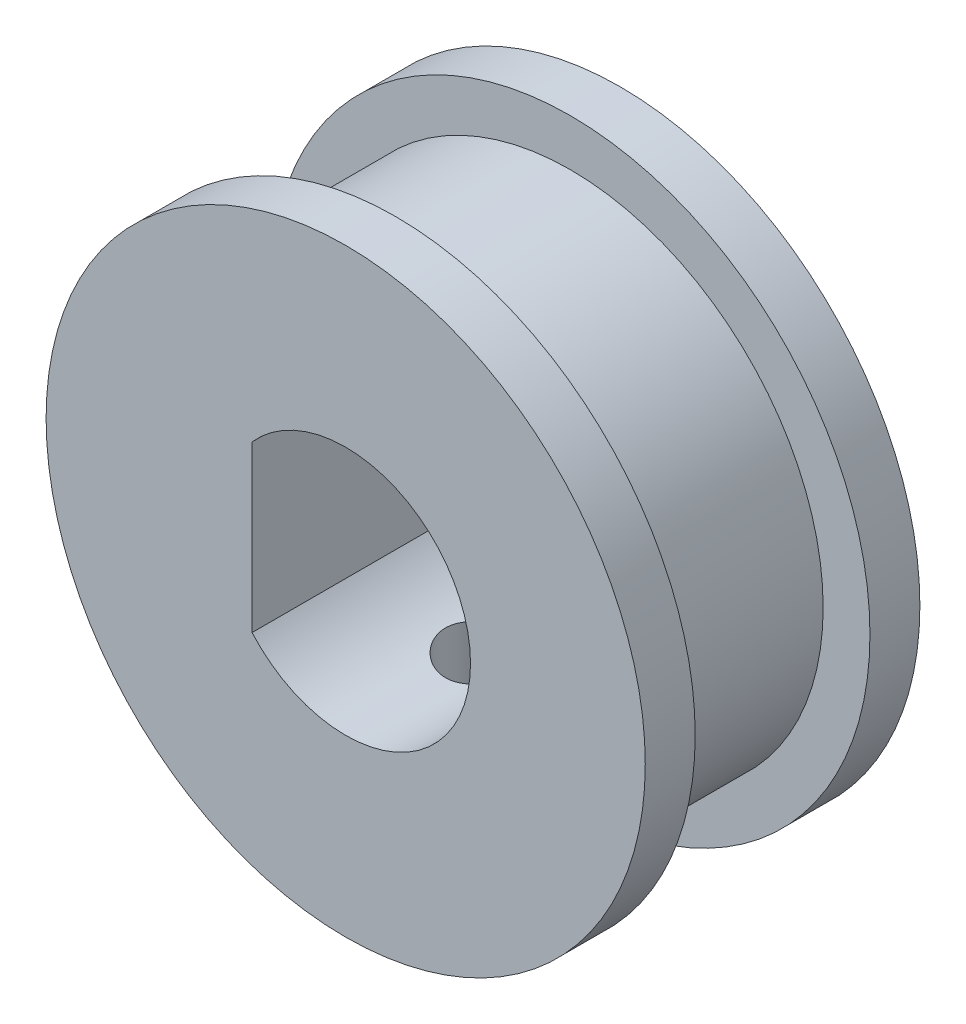
ISO-10303-21;
HEADER;
FILE_DESCRIPTION(('STEP AP214'),'2;1');
FILE_NAME('part.step','',(''),(''),'','','');
FILE_SCHEMA(('AUTOMOTIVE_DESIGN { 1 0 10303 214 1 1 1 1 }'));
ENDSEC;
DATA;
#1=APPLICATION_CONTEXT('core data for automotive mechanical design processes');
#2=APPLICATION_PROTOCOL_DEFINITION('international standard','automotive_design',2000,#1);
#3=PRODUCT_CONTEXT('',#1,'mechanical');
#4=PRODUCT('Part','Part','',(#3));
#5=PRODUCT_RELATED_PRODUCT_CATEGORY('part','',(#4));
#6=PRODUCT_DEFINITION_FORMATION('','',#4);
#7=PRODUCT_DEFINITION_CONTEXT('part definition',#1,'design');
#8=PRODUCT_DEFINITION('design','',#6,#7);
#9=PRODUCT_DEFINITION_SHAPE('','',#8);
#10=(LENGTH_UNIT() NAMED_UNIT(*) SI_UNIT(.MILLI.,.METRE.));
#11=(NAMED_UNIT(*) PLANE_ANGLE_UNIT() SI_UNIT($,.RADIAN.));
#12=(NAMED_UNIT(*) SI_UNIT($,.STERADIAN.) SOLID_ANGLE_UNIT());
#13=UNCERTAINTY_MEASURE_WITH_UNIT(LENGTH_MEASURE(1.E-05),#10,'distance_accuracy_value','');
#14=(GEOMETRIC_REPRESENTATION_CONTEXT(3) GLOBAL_UNCERTAINTY_ASSIGNED_CONTEXT((#13)) GLOBAL_UNIT_ASSIGNED_CONTEXT((#10,
#11,#12)) REPRESENTATION_CONTEXT('',''));
#15=CARTESIAN_POINT('',(0.,0.,0.));
#16=DIRECTION('',(0.,0.,1.));
#17=DIRECTION('',(1.,0.,0.));
#18=AXIS2_PLACEMENT_3D('',#15,#16,#17);
#19=CARTESIAN_POINT('',(0.,0.,3.5));
#20=DIRECTION('',(0.,0.,-1.));
#21=DIRECTION('',(-1.,0.,0.));
#22=AXIS2_PLACEMENT_3D('',#19,#20,#21);
#23=CYLINDRICAL_SURFACE('',#22,10.125);
#24=CARTESIAN_POINT('',(0.,-10.125,1.5));
#25=CARTESIAN_POINT('',(0.0837638113652493,-10.1249986690809,1.4999965364608));
#26=CARTESIAN_POINT('',(0.167576527266674,-10.1239496365079,1.49295993930032));
#27=CARTESIAN_POINT('',(0.332860107909288,-10.1198657946306,1.46500611770191));
#28=CARTESIAN_POINT('',(0.414328597579588,-10.1168290406185,1.44407529942512));
#29=CARTESIAN_POINT('',(0.572507755255597,-10.1091110862003,1.38897147390049));
#30=CARTESIAN_POINT('',(0.649221938171266,-10.1044311181231,1.35480838822025));
#31=CARTESIAN_POINT('',(0.795816796864536,-10.0939441396108,1.27423384307133));
#32=CARTESIAN_POINT('',(0.865698437520783,-10.0881372886587,1.2278241164839));
#33=CARTESIAN_POINT('',(0.997189526627415,-10.0759929611263,1.12369640264024));
#34=CARTESIAN_POINT('',(1.05873930827636,-10.0696521357657,1.06590345157246));
#35=CARTESIAN_POINT('',(1.17130478357067,-10.0571807833803,0.940811114197306));
#36=CARTESIAN_POINT('',(1.22231987716081,-10.0510502683515,0.873511186740605));
#37=CARTESIAN_POINT('',(1.31259935386314,-10.0396611330402,0.730915392536569));
#38=CARTESIAN_POINT('',(1.35180614707092,-10.034406839944,0.655582689202163));
#39=CARTESIAN_POINT('',(1.41698807406035,-10.0254106709424,0.49931062237877));
#40=CARTESIAN_POINT('',(1.44296391115152,-10.0216687146488,0.418371557163469));
#41=CARTESIAN_POINT('',(1.48076156498896,-10.0161537544874,0.253811248545279));
#42=CARTESIAN_POINT('',(1.49268543046269,-10.014366561579,0.170213928763024));
#43=CARTESIAN_POINT('',(1.50235677490334,-10.0129203791319,0.0021873130000883));
#44=CARTESIAN_POINT('',(1.50010504814121,-10.0132612703549,-0.0822419361022005));
#45=CARTESIAN_POINT('',(1.48157255204166,-10.01601976372,-0.248815669839024));
#46=CARTESIAN_POINT('',(1.46540533937245,-10.0184205556408,-0.330973106886233));
#47=CARTESIAN_POINT('',(1.41967851394471,-10.0250020854776,-0.491396128531784));
#48=CARTESIAN_POINT('',(1.39011853084709,-10.0291828726143,-0.569661605442587));
#49=CARTESIAN_POINT('',(1.31832684277617,-10.0388719316315,-0.720425121572834));
#50=CARTESIAN_POINT('',(1.27604693873346,-10.0443852368588,-0.79289987227854));
#51=CARTESIAN_POINT('',(1.18004991824751,-10.0561144642231,-0.929769053908086));
#52=CARTESIAN_POINT('',(1.12633206930943,-10.062330431347,-0.994162966908862));
#53=CARTESIAN_POINT('',(1.00836020058881,-10.0748389100312,-1.11370077783855));
#54=CARTESIAN_POINT('',(0.944008528396183,-10.0811315768469,-1.16874833202088));
#55=CARTESIAN_POINT('',(0.806928817458435,-10.0930280937204,-1.26727679323804));
#56=CARTESIAN_POINT('',(0.734200743644141,-10.0986319408942,-1.31075765184448));
#57=CARTESIAN_POINT('',(0.582349940447671,-10.1085250657243,-1.38492302245964));
#58=CARTESIAN_POINT('',(0.503223583282308,-10.1128135909035,-1.41560021327832));
#59=CARTESIAN_POINT('',(0.340864562425471,-10.1195865436355,-1.46320426122492));
#60=CARTESIAN_POINT('',(0.257632169847543,-10.1220710901317,-1.48013202491527));
#61=CARTESIAN_POINT('',(0.0902553766461194,-10.1249404149419,-1.49962885014899));
#62=CARTESIAN_POINT('',(0.00612672701644951,-10.1253445650426,-1.50233038587268));
#63=CARTESIAN_POINT('',(-0.161382384311351,-10.124060257838,-1.49364953410334));
#64=CARTESIAN_POINT('',(-0.244762868510274,-10.1223718636791,-1.48226757160584));
#65=CARTESIAN_POINT('',(-0.408008347122321,-10.117104163241,-1.44585296693453));
#66=CARTESIAN_POINT('',(-0.48788802662934,-10.1135337844542,-1.42088475536892));
#67=CARTESIAN_POINT('',(-0.642327306139718,-10.104901202049,-1.35807427665211));
#68=CARTESIAN_POINT('',(-0.71688666143652,-10.0998389298664,-1.32023141779688));
#69=CARTESIAN_POINT('',(-0.859152078466383,-10.0887371031823,-1.23243429509029));
#70=CARTESIAN_POINT('',(-0.926805666324396,-10.0826908586488,-1.18239586461557));
#71=CARTESIAN_POINT('',(-1.05280223392081,-10.0703151842522,-1.07174533800946));
#72=CARTESIAN_POINT('',(-1.11114468616479,-10.0639857383712,-1.01113264323176));
#73=CARTESIAN_POINT('',(-1.21734392495725,-10.0516957340842,-0.880464892598861));
#74=CARTESIAN_POINT('',(-1.26511198559047,-10.0457385774643,-0.810337356934592));
#75=CARTESIAN_POINT('',(-1.3481900599821,-10.0349275575465,-0.662976058004377));
#76=CARTESIAN_POINT('',(-1.38350040380324,-10.0300736650192,-0.585742483078749));
#77=CARTESIAN_POINT('',(-1.4405227057952,-10.0220432667678,-0.426627788295707));
#78=CARTESIAN_POINT('',(-1.46228162102523,-10.0188609748515,-0.344763801418272));
#79=CARTESIAN_POINT('',(-1.491733012766,-10.0145186092197,-0.178492869335527));
#80=CARTESIAN_POINT('',(-1.49942643478559,-10.0133583995762,-0.0940860954488826));
#81=CARTESIAN_POINT('',(-1.50050636915554,-10.0131965509632,0.0739901993020562));
#82=CARTESIAN_POINT('',(-1.49403237740492,-10.0141738653447,0.157658837065951));
#83=CARTESIAN_POINT('',(-1.46725990660619,-10.0181312446972,0.322703535168193));
#84=CARTESIAN_POINT('',(-1.44696144756782,-10.0211113067694,0.404079598824667));
#85=CARTESIAN_POINT('',(-1.3931651240166,-10.028731113209,0.562192133156529));
#86=CARTESIAN_POINT('',(-1.35967677019156,-10.0333696614888,0.638931900988818));
#87=CARTESIAN_POINT('',(-1.28046512251875,-10.0437852862523,0.7857262286719));
#88=CARTESIAN_POINT('',(-1.23474143492849,-10.0495623993743,0.855780573282172));
#89=CARTESIAN_POINT('',(-1.13184934701868,-10.0616719775735,0.98792457768452));
#90=CARTESIAN_POINT('',(-1.07457756951678,-10.0680091456143,1.04993332231593));
#91=CARTESIAN_POINT('',(-0.950433442596111,-10.0804853489398,1.16350978760627));
#92=CARTESIAN_POINT('',(-0.883558862617147,-10.0866243377841,1.2150750757095));
#93=CARTESIAN_POINT('',(-0.741686222732159,-10.0980500096474,1.30654714772199));
#94=CARTESIAN_POINT('',(-0.666646526866731,-10.103331946029,1.34638993522944));
#95=CARTESIAN_POINT('',(-0.510897957359262,-10.1124017542597,1.41284709898553));
#96=CARTESIAN_POINT('',(-0.43019507876428,-10.1161911787901,1.43947523016839));
#97=CARTESIAN_POINT('',(-0.290937991142248,-10.1209800941738,1.47267944614035));
#98=CARTESIAN_POINT('',(-0.233244968095915,-10.1224798489464,1.48290907213627));
#99=CARTESIAN_POINT('',(-0.117042583639427,-10.1244902609544,1.49657051851406));
#100=CARTESIAN_POINT('',(-0.0585332320113895,-10.1250009300317,1.50000242028318));
#101=CARTESIAN_POINT('',(0.,-10.125,1.5));
#102=B_SPLINE_CURVE_WITH_KNOTS('',3,(#24,#25,#26,#27,#28,#29,#30,#31,#32,#33,#34,#35,#36,#37,
#38,#39,#40,#41,#42,#43,#44,#45,#46,#47,#48,#49,#50,#51,#52,#53,#54,#55,#56,#57,#58,#59,#60,#61,
#62,#63,#64,#65,#66,#67,#68,#69,#70,#71,#72,#73,#74,#75,#76,#77,#78,#79,#80,#81,#82,#83,#84,#85,
#86,#87,#88,#89,#90,#91,#92,#93,#94,#95,#96,#97,#98,#99,#100,#101),.UNSPECIFIED.,.T.,.F.,(4,2,2,
2,2,2,2,2,2,2,2,2,2,2,2,2,2,2,2,2,2,2,2,2,2,2,2,2,2,2,2,2,2,2,2,2,2,2,4),(0.,0.251077554142502,
0.502401120508755,0.753536607868805,1.00463657897284,1.25744905426896,1.51027592577958,
1.76431659567471,2.01834376028179,2.27051452323561,2.5226711569646,2.77278937913918,
3.02291451804595,3.27399964581028,3.52510085809927,3.77865113545417,4.03220247437744,
4.28589859702827,4.53957799097868,4.79089089882474,5.0421962230253,5.29232002885766,
5.54245533164653,5.79436839552578,6.04629572572106,6.30026287771631,6.55422330043787,
6.80729875596697,7.06035719866375,7.31093518488099,7.56151280840874,7.81191008058056,
8.06231541169914,8.31507069785246,8.56788478982094,8.82205449054497,9.07595907208052,
9.25141141180508,9.42686165087542),.UNSPECIFIED.);
#103=CARTESIAN_POINT('',(0.,-10.125,1.5));
#104=VERTEX_POINT('',#103);
#105=EDGE_CURVE('E83',#104,#104,#102,.T.);
#106=ORIENTED_EDGE('',*,*,#105,.T.);
#107=EDGE_LOOP('',(#106));
#108=FACE_BOUND('',#107,.T.);
#109=CARTESIAN_POINT('',(0.,0.,3.5));
#110=DIRECTION('',(0.,0.,1.));
#111=DIRECTION('',(1.,0.,0.));
#112=AXIS2_PLACEMENT_3D('',#109,#110,#111);
#113=CIRCLE('',#112,10.125);
#114=CARTESIAN_POINT('',(10.125,0.,3.5));
#115=VERTEX_POINT('',#114);
#116=EDGE_CURVE('E11',#115,#115,#113,.T.);
#117=ORIENTED_EDGE('',*,*,#116,.F.);
#118=EDGE_LOOP('',(#117));
#119=FACE_BOUND('',#118,.T.);
#120=CARTESIAN_POINT('',(0.,0.,-3.5));
#121=DIRECTION('',(0.,0.,1.));
#122=DIRECTION('',(1.,0.,0.));
#123=AXIS2_PLACEMENT_3D('',#120,#121,#122);
#124=CIRCLE('',#123,10.125);
#125=CARTESIAN_POINT('',(10.125,0.,-3.5));
#126=VERTEX_POINT('',#125);
#127=EDGE_CURVE('E95',#126,#126,#124,.T.);
#128=ORIENTED_EDGE('',*,*,#127,.T.);
#129=EDGE_LOOP('',(#128));
#130=FACE_BOUND('',#129,.T.);
#131=ADVANCED_FACE('F35',(#108,#119,#130),#23,.T.);
#132=CARTESIAN_POINT('',(0.,0.,5.5));
#133=DIRECTION('',(0.,0.,-1.));
#134=DIRECTION('',(-1.,0.,0.));
#135=AXIS2_PLACEMENT_3D('',#132,#133,#134);
#136=CYLINDRICAL_SURFACE('',#135,12.);
#137=CARTESIAN_POINT('',(0.,0.,5.5));
#138=DIRECTION('',(0.,0.,1.));
#139=DIRECTION('',(1.,0.,0.));
#140=AXIS2_PLACEMENT_3D('',#137,#138,#139);
#141=CIRCLE('',#140,12.);
#142=CARTESIAN_POINT('',(12.,0.,5.5));
#143=VERTEX_POINT('',#142);
#144=EDGE_CURVE('E49',#143,#143,#141,.T.);
#145=ORIENTED_EDGE('',*,*,#144,.F.);
#146=EDGE_LOOP('',(#145));
#147=FACE_BOUND('',#146,.T.);
#148=CARTESIAN_POINT('',(0.,0.,3.5));
#149=DIRECTION('',(0.,0.,1.));
#150=DIRECTION('',(1.,0.,0.));
#151=AXIS2_PLACEMENT_3D('',#148,#149,#150);
#152=CIRCLE('',#151,12.);
#153=CARTESIAN_POINT('',(12.,0.,3.5));
#154=VERTEX_POINT('',#153);
#155=EDGE_CURVE('E100',#154,#154,#152,.T.);
#156=ORIENTED_EDGE('',*,*,#155,.T.);
#157=EDGE_LOOP('',(#156));
#158=FACE_BOUND('',#157,.T.);
#159=ADVANCED_FACE('F128',(#147,#158),#136,.T.);
#160=CARTESIAN_POINT('',(0.,0.,5.5));
#161=DIRECTION('',(0.,0.,1.));
#162=DIRECTION('',(1.,0.,0.));
#163=AXIS2_PLACEMENT_3D('',#160,#161,#162);
#164=PLANE('',#163);
#165=CARTESIAN_POINT('',(0.,0.,5.5));
#166=DIRECTION('',(0.,0.,1.));
#167=DIRECTION('',(1.,0.,0.));
#168=AXIS2_PLACEMENT_3D('',#165,#166,#167);
#169=CIRCLE('',#168,5.);
#170=CARTESIAN_POINT('',(-3.75,-3.30718913883074,5.5));
#171=VERTEX_POINT('',#170);
#172=CARTESIAN_POINT('',(-3.75,3.30718913883074,5.5));
#173=VERTEX_POINT('',#172);
#174=EDGE_CURVE('E57',#171,#173,#169,.T.);
#175=ORIENTED_EDGE('',*,*,#174,.F.);
#176=DIRECTION('',(0.,-1.,0.));
#177=VECTOR('',#176,1.);
#178=CARTESIAN_POINT('',(-3.75,3.30718913883074,5.5));
#179=LINE('',#178,#177);
#180=EDGE_CURVE('E77',#173,#171,#179,.T.);
#181=ORIENTED_EDGE('',*,*,#180,.F.);
#182=EDGE_LOOP('',(#175,#181));
#183=FACE_BOUND('',#182,.T.);
#184=ORIENTED_EDGE('',*,*,#144,.T.);
#185=EDGE_LOOP('',(#184));
#186=FACE_BOUND('',#185,.T.);
#187=ADVANCED_FACE('F81',(#183,#186),#164,.T.);
#188=CARTESIAN_POINT('',(0.,0.,3.5));
#189=DIRECTION('',(0.,0.,1.));
#190=DIRECTION('',(1.,0.,0.));
#191=AXIS2_PLACEMENT_3D('',#188,#189,#190);
#192=PLANE('',#191);
#193=ORIENTED_EDGE('',*,*,#116,.T.);
#194=EDGE_LOOP('',(#193));
#195=FACE_BOUND('',#194,.T.);
#196=ORIENTED_EDGE('',*,*,#155,.F.);
#197=EDGE_LOOP('',(#196));
#198=FACE_BOUND('',#197,.T.);
#199=ADVANCED_FACE('F115',(#195,#198),#192,.F.);
#200=CARTESIAN_POINT('',(0.,0.,-5.5));
#201=DIRECTION('',(0.,0.,1.));
#202=DIRECTION('',(1.,0.,0.));
#203=AXIS2_PLACEMENT_3D('',#200,#201,#202);
#204=CYLINDRICAL_SURFACE('',#203,12.);
#205=CARTESIAN_POINT('',(0.,0.,-5.5));
#206=DIRECTION('',(0.,0.,1.));
#207=DIRECTION('',(1.,0.,0.));
#208=AXIS2_PLACEMENT_3D('',#205,#206,#207);
#209=CIRCLE('',#208,12.);
#210=CARTESIAN_POINT('',(12.,0.,-5.5));
#211=VERTEX_POINT('',#210);
#212=EDGE_CURVE('E92',#211,#211,#209,.T.);
#213=ORIENTED_EDGE('',*,*,#212,.T.);
#214=EDGE_LOOP('',(#213));
#215=FACE_BOUND('',#214,.T.);
#216=CARTESIAN_POINT('',(0.,0.,-3.5));
#217=DIRECTION('',(0.,0.,1.));
#218=DIRECTION('',(1.,0.,0.));
#219=AXIS2_PLACEMENT_3D('',#216,#217,#218);
#220=CIRCLE('',#219,12.);
#221=CARTESIAN_POINT('',(12.,0.,-3.5));
#222=VERTEX_POINT('',#221);
#223=EDGE_CURVE('E73',#222,#222,#220,.T.);
#224=ORIENTED_EDGE('',*,*,#223,.F.);
#225=EDGE_LOOP('',(#224));
#226=FACE_BOUND('',#225,.T.);
#227=ADVANCED_FACE('F113',(#215,#226),#204,.T.);
#228=CARTESIAN_POINT('',(0.,0.,-5.5));
#229=DIRECTION('',(0.,0.,-1.));
#230=DIRECTION('',(1.,0.,0.));
#231=AXIS2_PLACEMENT_3D('',#228,#229,#230);
#232=PLANE('',#231);
#233=CARTESIAN_POINT('',(0.,0.,-5.5));
#234=DIRECTION('',(0.,0.,1.));
#235=DIRECTION('',(1.,0.,0.));
#236=AXIS2_PLACEMENT_3D('',#233,#234,#235);
#237=CIRCLE('',#236,5.);
#238=CARTESIAN_POINT('',(-3.75,-3.30718913883074,-5.5));
#239=VERTEX_POINT('',#238);
#240=CARTESIAN_POINT('',(-3.75,3.30718913883074,-5.5));
#241=VERTEX_POINT('',#240);
#242=EDGE_CURVE('E62',#239,#241,#237,.T.);
#243=ORIENTED_EDGE('',*,*,#242,.T.);
#244=DIRECTION('',(0.,-1.,0.));
#245=VECTOR('',#244,1.);
#246=CARTESIAN_POINT('',(-3.75,3.30718913883074,-5.5));
#247=LINE('',#246,#245);
#248=EDGE_CURVE('E88',#241,#239,#247,.T.);
#249=ORIENTED_EDGE('',*,*,#248,.T.);
#250=EDGE_LOOP('',(#243,#249));
#251=FACE_BOUND('',#250,.T.);
#252=ORIENTED_EDGE('',*,*,#212,.F.);
#253=EDGE_LOOP('',(#252));
#254=FACE_BOUND('',#253,.T.);
#255=ADVANCED_FACE('F109',(#251,#254),#232,.T.);
#256=CARTESIAN_POINT('',(0.,0.,-3.5));
#257=DIRECTION('',(0.,0.,-1.));
#258=DIRECTION('',(1.,0.,0.));
#259=AXIS2_PLACEMENT_3D('',#256,#257,#258);
#260=PLANE('',#259);
#261=ORIENTED_EDGE('',*,*,#127,.F.);
#262=EDGE_LOOP('',(#261));
#263=FACE_BOUND('',#262,.T.);
#264=ORIENTED_EDGE('',*,*,#223,.T.);
#265=EDGE_LOOP('',(#264));
#266=FACE_BOUND('',#265,.T.);
#267=ADVANCED_FACE('F106',(#263,#266),#260,.F.);
#268=CARTESIAN_POINT('',(0.,0.,-5.5));
#269=DIRECTION('',(0.,0.,1.));
#270=DIRECTION('',(1.,0.,0.));
#271=AXIS2_PLACEMENT_3D('',#268,#269,#270);
#272=CYLINDRICAL_SURFACE('',#271,5.);
#273=CARTESIAN_POINT('',(0.,-5.,1.5));
#274=CARTESIAN_POINT('',(-0.0822886127532999,-4.9999992925055,1.49999900251511));
#275=CARTESIAN_POINT('',(-0.164587318351529,-4.99794915693954,1.49320613637603));
#276=CARTESIAN_POINT('',(-0.326788125304881,-4.98997105593691,1.4662786457779));
#277=CARTESIAN_POINT('',(-0.40668950441142,-4.98404193389692,1.44614004197666));
#278=CARTESIAN_POINT('',(-0.561732707754526,-4.96895552501836,1.39325398308974));
#279=CARTESIAN_POINT('',(-0.636881364395372,-4.95980300250425,1.36052513038106));
#280=CARTESIAN_POINT('',(-0.780624181053131,-4.93922109237645,1.28346390694416));
#281=CARTESIAN_POINT('',(-0.849217467469669,-4.92779140192067,1.23912999260458));
#282=CARTESIAN_POINT('',(-0.979871797183745,-4.90350737192774,1.13877599252733));
#283=CARTESIAN_POINT('',(-1.04171807124434,-4.89062383657036,1.08248337411409));
#284=CARTESIAN_POINT('',(-1.15524920923324,-4.86505834210442,0.960390770089816));
#285=CARTESIAN_POINT('',(-1.20693236327441,-4.85237641724501,0.894589187875041));
#286=CARTESIAN_POINT('',(-1.29980037723708,-4.82834113993772,0.753529246962389));
#287=CARTESIAN_POINT('',(-1.34072309022213,-4.81702406663875,0.678091539009263));
#288=CARTESIAN_POINT('',(-1.4092139477476,-4.79743620394031,0.521010745769708));
#289=CARTESIAN_POINT('',(-1.43678529919973,-4.78916468313311,0.439369156072025));
#290=CARTESIAN_POINT('',(-1.47701633682652,-4.77690870838434,0.274609733869541));
#291=CARTESIAN_POINT('',(-1.49007196234677,-4.77281069324533,0.191597256136057));
#292=CARTESIAN_POINT('',(-1.50213730614672,-4.76902789749767,0.0244668437832347));
#293=CARTESIAN_POINT('',(-1.50115042761078,-4.76934204760571,-0.0596508180590873));
#294=CARTESIAN_POINT('',(-1.48546977199812,-4.77424744067778,-0.223383908608484));
#295=CARTESIAN_POINT('',(-1.47127205262685,-4.7786838859914,-0.303052250362238));
#296=CARTESIAN_POINT('',(-1.43037420427056,-4.79108356228624,-0.45881978627346));
#297=CARTESIAN_POINT('',(-1.40367284141641,-4.79904714132351,-0.534918627374333));
#298=CARTESIAN_POINT('',(-1.33816026653682,-4.81772733074973,-0.682600349660739));
#299=CARTESIAN_POINT('',(-1.29918816934643,-4.82848016115952,-0.754107083955262));
#300=CARTESIAN_POINT('',(-1.21035222588683,-4.85150987000065,-0.889732022010192));
#301=CARTESIAN_POINT('',(-1.16048574002588,-4.86378711746991,-0.953848429413778));
#302=CARTESIAN_POINT('',(-1.04881290765546,-4.88911011297937,-1.07568619076202));
#303=CARTESIAN_POINT('',(-0.986594907466972,-4.90216654310498,-1.13302866402967));
#304=CARTESIAN_POINT('',(-0.853263259313967,-4.92712244063259,-1.23655398406425));
#305=CARTESIAN_POINT('',(-0.782149051860888,-4.9390218351841,-1.28273612841443));
#306=CARTESIAN_POINT('',(-0.632355038342803,-4.9604316006947,-1.36285992246473));
#307=CARTESIAN_POINT('',(-0.55362774974795,-4.96992543668314,-1.39671751624986));
#308=CARTESIAN_POINT('',(-0.391245415603519,-4.98533521832222,-1.45059959009963));
#309=CARTESIAN_POINT('',(-0.307591751589581,-4.99125216186999,-1.47062792853249));
#310=CARTESIAN_POINT('',(-0.140952242668332,-4.99868364643538,-1.49565217789939));
#311=CARTESIAN_POINT('',(-0.0580500976011869,-5.0003485041779,-1.50116158580161));
#312=CARTESIAN_POINT('',(0.107499605823383,-4.9995292324176,-1.49843084428792));
#313=CARTESIAN_POINT('',(0.190147196690781,-4.99704565677756,-1.49019253034856));
#314=CARTESIAN_POINT('',(0.350903605309697,-4.98830696987163,-1.4606153888885));
#315=CARTESIAN_POINT('',(0.429072772614169,-4.98213829799417,-1.43957661241913));
#316=CARTESIAN_POINT('',(0.580754638954521,-4.96674347841532,-1.3853567672218));
#317=CARTESIAN_POINT('',(0.654266777025583,-4.95751696321085,-1.35217423896214));
#318=CARTESIAN_POINT('',(0.796437189461052,-4.93669654351325,-1.27374683451887));
#319=CARTESIAN_POINT('',(0.864943826199669,-4.92505280829675,-1.22824065905203));
#320=CARTESIAN_POINT('',(0.993523307980146,-4.90073468764318,-1.12677524594719));
#321=CARTESIAN_POINT('',(1.05359403235593,-4.8880600443108,-1.07081338811233));
#322=CARTESIAN_POINT('',(1.16585744551027,-4.86253171869138,-0.947612691630655));
#323=CARTESIAN_POINT('',(1.21768481231503,-4.84968825033268,-0.880038124228264));
#324=CARTESIAN_POINT('',(1.30928995072154,-4.82576515238463,-0.736872060986468));
#325=CARTESIAN_POINT('',(1.34906803829472,-4.81468547654651,-0.661280775441786));
#326=CARTESIAN_POINT('',(1.41517347127168,-4.79567189615055,-0.504467508745313));
#327=CARTESIAN_POINT('',(1.4415634693705,-4.78772337843827,-0.42327381346341));
#328=CARTESIAN_POINT('',(1.48021730815114,-4.77591594362794,-0.257312031068523));
#329=CARTESIAN_POINT('',(1.49248598978779,-4.772055625083,-0.172545179212331));
#330=CARTESIAN_POINT('',(1.50221984485059,-4.76899972496087,-0.0056384816237726));
#331=CARTESIAN_POINT('',(1.5002805530849,-4.76961647442754,0.0764636510175859));
#332=CARTESIAN_POINT('',(1.48307505444813,-4.77499401288294,0.2391141033728));
#333=CARTESIAN_POINT('',(1.46780938124716,-4.77975463592551,0.319662485176353));
#334=CARTESIAN_POINT('',(1.42476888804136,-4.79275763670386,0.475945399142852));
#335=CARTESIAN_POINT('',(1.39715175507068,-4.80095604545965,0.551727287361694));
#336=CARTESIAN_POINT('',(1.33031507121129,-4.81990278909136,0.697642438817724));
#337=CARTESIAN_POINT('',(1.29109329962876,-4.83065161194312,0.767774617640757));
#338=CARTESIAN_POINT('',(1.20048763805072,-4.85397676425833,0.903163116527113));
#339=CARTESIAN_POINT('',(1.14871276092994,-4.86660540163798,0.968148761260411));
#340=CARTESIAN_POINT('',(1.03517434629782,-4.89201320450026,1.08870249830786));
#341=CARTESIAN_POINT('',(0.973408217134501,-4.90479240823905,1.14426813946776));
#342=CARTESIAN_POINT('',(0.839465762183248,-4.92950936570649,1.24602341229503));
#343=CARTESIAN_POINT('',(0.767037885790608,-4.94141159765674,1.29189144685549));
#344=CARTESIAN_POINT('',(0.61514137398353,-4.96260680455813,1.37073516990402));
#345=CARTESIAN_POINT('',(0.535676052998955,-4.97190099931067,1.40371688827451));
#346=CARTESIAN_POINT('',(0.380757712655281,-4.98602174969301,1.45289527565275));
#347=CARTESIAN_POINT('',(0.305786961954234,-4.99122027381068,1.47051167288325));
#348=CARTESIAN_POINT('',(0.15388019523078,-4.99820944494492,1.49406352524158));
#349=CARTESIAN_POINT('',(0.0769445098581397,-5.0000006615474,1.50000093270482));
#350=CARTESIAN_POINT('',(0.,-5.,1.5));
#351=B_SPLINE_CURVE_WITH_KNOTS('',3,(#273,#274,#275,#276,#277,#278,#279,#280,#281,#282,#283,
#284,#285,#286,#287,#288,#289,#290,#291,#292,#293,#294,#295,#296,#297,#298,#299,#300,#301,#302,
#303,#304,#305,#306,#307,#308,#309,#310,#311,#312,#313,#314,#315,#316,#317,#318,#319,#320,#321,
#322,#323,#324,#325,#326,#327,#328,#329,#330,#331,#332,#333,#334,#335,#336,#337,#338,#339,#340,
#341,#342,#343,#344,#345,#346,#347,#348,#349,#350),.UNSPECIFIED.,.T.,.F.,(4,2,2,2,2,2,2,2,2,2,2,
2,2,2,2,2,2,2,2,2,2,2,2,2,2,2,2,2,2,2,2,2,2,2,2,2,2,2,4),(0.,0.246583203612611,
0.493239964845999,0.739533676300874,0.985860164412701,1.23855602948191,1.49129437288633,
1.74971481004109,2.00807314543224,2.25919689356599,2.51025978319089,2.75226016697676,
2.99428443658001,3.23962426447119,3.48502360158555,3.74067104048167,3.99633456531071,
4.25371046881688,4.51101453528808,4.75908809438545,5.00712853550327,5.24956746682327,
5.49203554593728,5.74011305702908,5.98825282000191,6.24540400322818,6.5025484425268,
6.75847814951252,7.01432009460283,7.25950155466943,7.504673196616,7.74680040402721,
7.98897397553107,8.23996925679931,8.49102974897502,8.74942996156671,9.00770911595235,
9.23831691930459,9.46888616948874),.UNSPECIFIED.);
#352=CARTESIAN_POINT('',(0.,-5.,1.5));
#353=VERTEX_POINT('',#352);
#354=EDGE_CURVE('E39',#353,#353,#351,.T.);
#355=ORIENTED_EDGE('',*,*,#354,.T.);
#356=EDGE_LOOP('',(#355));
#357=FACE_BOUND('',#356,.T.);
#358=ORIENTED_EDGE('',*,*,#174,.T.);
#359=DIRECTION('',(0.,0.,1.));
#360=VECTOR('',#359,1.);
#361=CARTESIAN_POINT('',(-3.75,3.30718913883074,-5.5));
#362=LINE('',#361,#360);
#363=EDGE_CURVE('E74',#241,#173,#362,.T.);
#364=ORIENTED_EDGE('',*,*,#363,.F.);
#365=ORIENTED_EDGE('',*,*,#242,.F.);
#366=DIRECTION('',(0.,0.,1.));
#367=VECTOR('',#366,1.);
#368=CARTESIAN_POINT('',(-3.75,-3.30718913883074,-5.5));
#369=LINE('',#368,#367);
#370=EDGE_CURVE('E67',#239,#171,#369,.T.);
#371=ORIENTED_EDGE('',*,*,#370,.T.);
#372=EDGE_LOOP('',(#358,#364,#365,#371));
#373=FACE_BOUND('',#372,.T.);
#374=ADVANCED_FACE('F69',(#357,#373),#272,.F.);
#375=CARTESIAN_POINT('',(-3.75,3.30718913883074,-5.5));
#376=DIRECTION('',(-1.,0.,0.));
#377=DIRECTION('',(0.,0.,1.));
#378=AXIS2_PLACEMENT_3D('',#375,#376,#377);
#379=PLANE('',#378);
#380=ORIENTED_EDGE('',*,*,#180,.T.);
#381=ORIENTED_EDGE('',*,*,#370,.F.);
#382=ORIENTED_EDGE('',*,*,#248,.F.);
#383=ORIENTED_EDGE('',*,*,#363,.T.);
#384=EDGE_LOOP('',(#380,#381,#382,#383));
#385=FACE_BOUND('',#384,.T.);
#386=ADVANCED_FACE('F78',(#385),#379,.F.);
#387=CARTESIAN_POINT('',(0.,-12.,0.));
#388=DIRECTION('',(0.,1.,0.));
#389=DIRECTION('',(0.,0.,1.));
#390=AXIS2_PLACEMENT_3D('',#387,#388,#389);
#391=CYLINDRICAL_SURFACE('',#390,1.5);
#392=ORIENTED_EDGE('',*,*,#354,.F.);
#393=EDGE_LOOP('',(#392));
#394=FACE_BOUND('',#393,.T.);
#395=ORIENTED_EDGE('',*,*,#105,.F.);
#396=EDGE_LOOP('',(#395));
#397=FACE_BOUND('',#396,.T.);
#398=ADVANCED_FACE('F141',(#394,#397),#391,.F.);
#399=CLOSED_SHELL('',(#131,#159,#187,#199,#227,#255,#267,#374,#386,#398));
#400=MANIFOLD_SOLID_BREP('B2',#399);
#401=ADVANCED_BREP_SHAPE_REPRESENTATION('',(#18,#400),#14);
#402=SHAPE_DEFINITION_REPRESENTATION(#9,#401);
ENDSEC;
END-ISO-10303-21;
